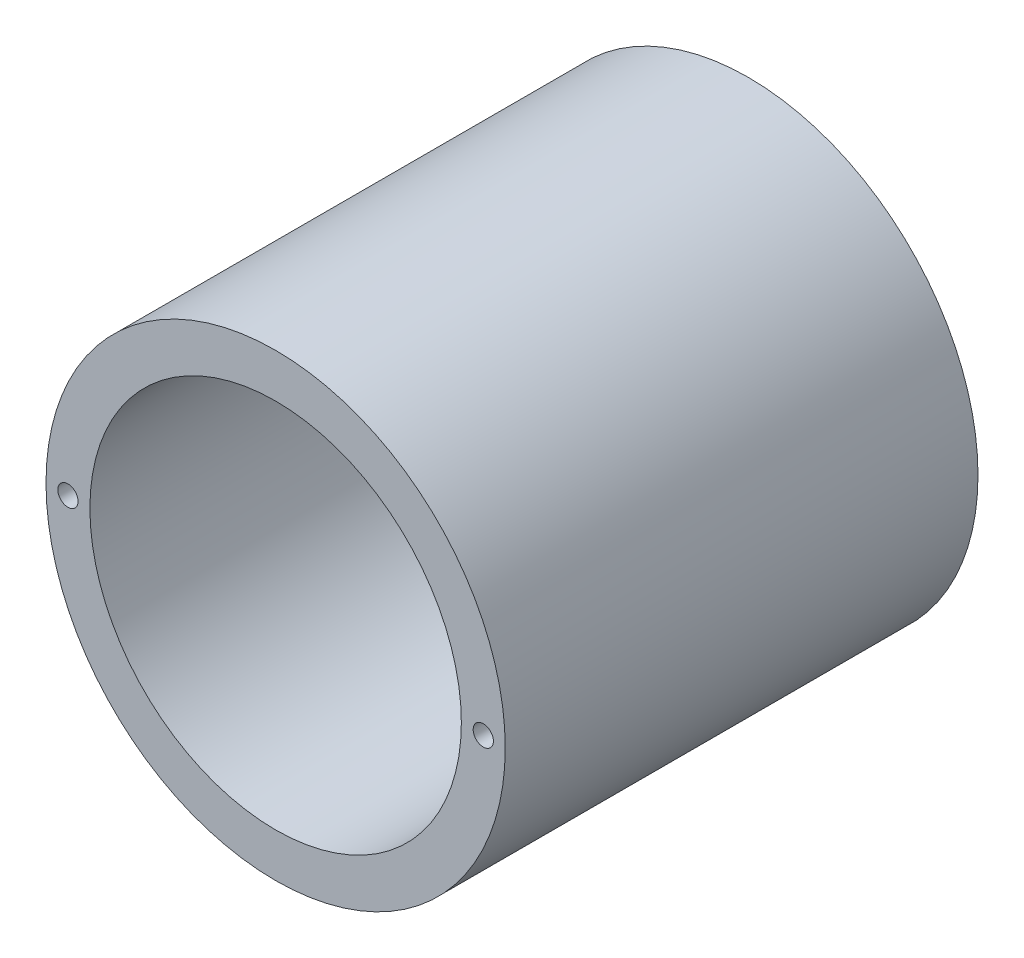
ISO-10303-21;
HEADER;
FILE_DESCRIPTION(('STEP AP214'),'2;1');
FILE_NAME('part.step','',(''),(''),'','','');
FILE_SCHEMA(('AUTOMOTIVE_DESIGN { 1 0 10303 214 1 1 1 1 }'));
ENDSEC;
DATA;
#1=APPLICATION_CONTEXT('core data for automotive mechanical design processes');
#2=APPLICATION_PROTOCOL_DEFINITION('international standard','automotive_design',2000,#1);
#3=PRODUCT_CONTEXT('',#1,'mechanical');
#4=PRODUCT('Part','Part','',(#3));
#5=PRODUCT_RELATED_PRODUCT_CATEGORY('part','',(#4));
#6=PRODUCT_DEFINITION_FORMATION('','',#4);
#7=PRODUCT_DEFINITION_CONTEXT('part definition',#1,'design');
#8=PRODUCT_DEFINITION('design','',#6,#7);
#9=PRODUCT_DEFINITION_SHAPE('','',#8);
#10=(LENGTH_UNIT() NAMED_UNIT(*) SI_UNIT(.MILLI.,.METRE.));
#11=(NAMED_UNIT(*) PLANE_ANGLE_UNIT() SI_UNIT($,.RADIAN.));
#12=(NAMED_UNIT(*) SI_UNIT($,.STERADIAN.) SOLID_ANGLE_UNIT());
#13=UNCERTAINTY_MEASURE_WITH_UNIT(LENGTH_MEASURE(1.E-05),#10,'distance_accuracy_value','');
#14=(GEOMETRIC_REPRESENTATION_CONTEXT(3) GLOBAL_UNCERTAINTY_ASSIGNED_CONTEXT((#13)) GLOBAL_UNIT_ASSIGNED_CONTEXT((#10,
#11,#12)) REPRESENTATION_CONTEXT('',''));
#15=CARTESIAN_POINT('',(0.,0.,0.));
#16=DIRECTION('',(0.,0.,1.));
#17=DIRECTION('',(1.,0.,0.));
#18=AXIS2_PLACEMENT_3D('',#15,#16,#17);
#19=CARTESIAN_POINT('',(0.,0.,70.));
#20=DIRECTION('',(0.,0.,-1.));
#21=DIRECTION('',(-1.,0.,0.));
#22=AXIS2_PLACEMENT_3D('',#19,#20,#21);
#23=CYLINDRICAL_SURFACE('',#22,34.);
#24=CARTESIAN_POINT('',(0.,0.,70.));
#25=DIRECTION('',(0.,0.,1.));
#26=DIRECTION('',(1.,0.,0.));
#27=AXIS2_PLACEMENT_3D('',#24,#25,#26);
#28=CIRCLE('',#27,34.);
#29=CARTESIAN_POINT('',(34.,0.,70.));
#30=VERTEX_POINT('',#29);
#31=EDGE_CURVE('E11',#30,#30,#28,.T.);
#32=ORIENTED_EDGE('',*,*,#31,.F.);
#33=EDGE_LOOP('',(#32));
#34=FACE_BOUND('',#33,.T.);
#35=CARTESIAN_POINT('',(0.,0.,0.));
#36=DIRECTION('',(0.,0.,1.));
#37=DIRECTION('',(1.,0.,0.));
#38=AXIS2_PLACEMENT_3D('',#35,#36,#37);
#39=CIRCLE('',#38,34.);
#40=CARTESIAN_POINT('',(34.,0.,0.));
#41=VERTEX_POINT('',#40);
#42=EDGE_CURVE('E42',#41,#41,#39,.T.);
#43=ORIENTED_EDGE('',*,*,#42,.T.);
#44=EDGE_LOOP('',(#43));
#45=FACE_BOUND('',#44,.T.);
#46=ADVANCED_FACE('F39',(#34,#45),#23,.T.);
#47=CARTESIAN_POINT('',(0.,0.,70.));
#48=DIRECTION('',(0.,0.,1.));
#49=DIRECTION('',(1.,0.,0.));
#50=AXIS2_PLACEMENT_3D('',#47,#48,#49);
#51=PLANE('',#50);
#52=CARTESIAN_POINT('',(-30.75,0.,70.));
#53=DIRECTION('',(0.,0.,1.));
#54=DIRECTION('',(1.,0.,0.));
#55=AXIS2_PLACEMENT_3D('',#52,#53,#54);
#56=CIRCLE('',#55,1.5);
#57=CARTESIAN_POINT('',(-29.25,0.,70.));
#58=VERTEX_POINT('',#57);
#59=EDGE_CURVE('E97',#58,#58,#56,.T.);
#60=ORIENTED_EDGE('',*,*,#59,.F.);
#61=EDGE_LOOP('',(#60));
#62=FACE_BOUND('',#61,.T.);
#63=CARTESIAN_POINT('',(30.75,0.,70.));
#64=DIRECTION('',(0.,0.,1.));
#65=DIRECTION('',(1.,0.,0.));
#66=AXIS2_PLACEMENT_3D('',#63,#64,#65);
#67=CIRCLE('',#66,1.5);
#68=CARTESIAN_POINT('',(32.25,0.,70.));
#69=VERTEX_POINT('',#68);
#70=EDGE_CURVE('E92',#69,#69,#67,.T.);
#71=ORIENTED_EDGE('',*,*,#70,.F.);
#72=EDGE_LOOP('',(#71));
#73=FACE_BOUND('',#72,.T.);
#74=CARTESIAN_POINT('',(0.,0.,70.));
#75=DIRECTION('',(0.,0.,1.));
#76=DIRECTION('',(1.,0.,0.));
#77=AXIS2_PLACEMENT_3D('',#74,#75,#76);
#78=CIRCLE('',#77,27.5);
#79=CARTESIAN_POINT('',(27.5,0.,70.));
#80=VERTEX_POINT('',#79);
#81=EDGE_CURVE('E114',#80,#80,#78,.T.);
#82=ORIENTED_EDGE('',*,*,#81,.F.);
#83=EDGE_LOOP('',(#82));
#84=FACE_BOUND('',#83,.T.);
#85=ORIENTED_EDGE('',*,*,#31,.T.);
#86=EDGE_LOOP('',(#85));
#87=FACE_BOUND('',#86,.T.);
#88=ADVANCED_FACE('F125',(#62,#73,#84,#87),#51,.T.);
#89=CARTESIAN_POINT('',(0.,0.,0.));
#90=DIRECTION('',(0.,0.,1.));
#91=DIRECTION('',(1.,0.,0.));
#92=AXIS2_PLACEMENT_3D('',#89,#90,#91);
#93=PLANE('',#92);
#94=CARTESIAN_POINT('',(10.,22.,0.));
#95=DIRECTION('',(0.,0.,-1.));
#96=DIRECTION('',(-1.,0.,0.));
#97=AXIS2_PLACEMENT_3D('',#94,#95,#96);
#98=CIRCLE('',#97,2.1);
#99=CARTESIAN_POINT('',(7.9,22.,0.));
#100=VERTEX_POINT('',#99);
#101=EDGE_CURVE('E70',#100,#100,#98,.T.);
#102=ORIENTED_EDGE('',*,*,#101,.F.);
#103=EDGE_LOOP('',(#102));
#104=FACE_BOUND('',#103,.T.);
#105=CARTESIAN_POINT('',(-10.,22.,0.));
#106=DIRECTION('',(0.,0.,-1.));
#107=DIRECTION('',(-1.,0.,0.));
#108=AXIS2_PLACEMENT_3D('',#105,#106,#107);
#109=CIRCLE('',#108,2.1);
#110=CARTESIAN_POINT('',(-12.1,22.,0.));
#111=VERTEX_POINT('',#110);
#112=EDGE_CURVE('E69',#111,#111,#109,.T.);
#113=ORIENTED_EDGE('',*,*,#112,.F.);
#114=EDGE_LOOP('',(#113));
#115=FACE_BOUND('',#114,.T.);
#116=CARTESIAN_POINT('',(-10.,-22.,0.));
#117=DIRECTION('',(0.,0.,-1.));
#118=DIRECTION('',(-1.,0.,0.));
#119=AXIS2_PLACEMENT_3D('',#116,#117,#118);
#120=CIRCLE('',#119,2.1);
#121=CARTESIAN_POINT('',(-12.1,-22.,0.));
#122=VERTEX_POINT('',#121);
#123=EDGE_CURVE('E80',#122,#122,#120,.T.);
#124=ORIENTED_EDGE('',*,*,#123,.F.);
#125=EDGE_LOOP('',(#124));
#126=FACE_BOUND('',#125,.T.);
#127=CARTESIAN_POINT('',(10.,-22.,0.));
#128=DIRECTION('',(0.,0.,-1.));
#129=DIRECTION('',(-1.,0.,0.));
#130=AXIS2_PLACEMENT_3D('',#127,#128,#129);
#131=CIRCLE('',#130,2.1);
#132=CARTESIAN_POINT('',(7.9,-22.,0.));
#133=VERTEX_POINT('',#132);
#134=EDGE_CURVE('E86',#133,#133,#131,.T.);
#135=ORIENTED_EDGE('',*,*,#134,.F.);
#136=EDGE_LOOP('',(#135));
#137=FACE_BOUND('',#136,.T.);
#138=CARTESIAN_POINT('',(0.,0.,0.));
#139=DIRECTION('',(0.,0.,-1.));
#140=DIRECTION('',(-1.,0.,0.));
#141=AXIS2_PLACEMENT_3D('',#138,#139,#140);
#142=CIRCLE('',#141,12.);
#143=CARTESIAN_POINT('',(-12.,0.,0.));
#144=VERTEX_POINT('',#143);
#145=EDGE_CURVE('E96',#144,#144,#142,.T.);
#146=ORIENTED_EDGE('',*,*,#145,.F.);
#147=EDGE_LOOP('',(#146));
#148=FACE_BOUND('',#147,.T.);
#149=ORIENTED_EDGE('',*,*,#42,.F.);
#150=EDGE_LOOP('',(#149));
#151=FACE_BOUND('',#150,.T.);
#152=ADVANCED_FACE('F128',(#104,#115,#126,#137,#148,#151),#93,.F.);
#153=CARTESIAN_POINT('',(0.,0.,30.));
#154=DIRECTION('',(0.,0.,1.));
#155=DIRECTION('',(1.,0.,0.));
#156=AXIS2_PLACEMENT_3D('',#153,#154,#155);
#157=CYLINDRICAL_SURFACE('',#156,27.5);
#158=CARTESIAN_POINT('',(0.,0.,30.));
#159=DIRECTION('',(0.,0.,1.));
#160=DIRECTION('',(1.,0.,0.));
#161=AXIS2_PLACEMENT_3D('',#158,#159,#160);
#162=CIRCLE('',#161,27.5);
#163=CARTESIAN_POINT('',(27.5,0.,30.));
#164=VERTEX_POINT('',#163);
#165=EDGE_CURVE('E117',#164,#164,#162,.T.);
#166=ORIENTED_EDGE('',*,*,#165,.F.);
#167=EDGE_LOOP('',(#166));
#168=FACE_BOUND('',#167,.T.);
#169=ORIENTED_EDGE('',*,*,#81,.T.);
#170=EDGE_LOOP('',(#169));
#171=FACE_BOUND('',#170,.T.);
#172=ADVANCED_FACE('F123',(#168,#171),#157,.F.);
#173=CARTESIAN_POINT('',(0.,0.,30.));
#174=DIRECTION('',(0.,0.,1.));
#175=DIRECTION('',(1.,0.,0.));
#176=AXIS2_PLACEMENT_3D('',#173,#174,#175);
#177=PLANE('',#176);
#178=CARTESIAN_POINT('',(0.,0.,30.));
#179=DIRECTION('',(0.,0.,1.));
#180=DIRECTION('',(1.,0.,0.));
#181=AXIS2_PLACEMENT_3D('',#178,#179,#180);
#182=CIRCLE('',#181,21.5);
#183=CARTESIAN_POINT('',(21.5,0.,30.));
#184=VERTEX_POINT('',#183);
#185=EDGE_CURVE('E108',#184,#184,#182,.T.);
#186=ORIENTED_EDGE('',*,*,#185,.F.);
#187=EDGE_LOOP('',(#186));
#188=FACE_BOUND('',#187,.T.);
#189=ORIENTED_EDGE('',*,*,#165,.T.);
#190=EDGE_LOOP('',(#189));
#191=FACE_BOUND('',#190,.T.);
#192=ADVANCED_FACE('F143',(#188,#191),#177,.T.);
#193=CARTESIAN_POINT('',(0.,0.,20.));
#194=DIRECTION('',(0.,0.,1.));
#195=DIRECTION('',(1.,0.,0.));
#196=AXIS2_PLACEMENT_3D('',#193,#194,#195);
#197=CYLINDRICAL_SURFACE('',#196,21.5);
#198=CARTESIAN_POINT('',(0.,0.,20.));
#199=DIRECTION('',(0.,0.,1.));
#200=DIRECTION('',(1.,0.,0.));
#201=AXIS2_PLACEMENT_3D('',#198,#199,#200);
#202=CIRCLE('',#201,21.5);
#203=CARTESIAN_POINT('',(21.5,0.,20.));
#204=VERTEX_POINT('',#203);
#205=EDGE_CURVE('E111',#204,#204,#202,.T.);
#206=ORIENTED_EDGE('',*,*,#205,.F.);
#207=EDGE_LOOP('',(#206));
#208=FACE_BOUND('',#207,.T.);
#209=ORIENTED_EDGE('',*,*,#185,.T.);
#210=EDGE_LOOP('',(#209));
#211=FACE_BOUND('',#210,.T.);
#212=ADVANCED_FACE('F151',(#208,#211),#197,.F.);
#213=CARTESIAN_POINT('',(0.,0.,20.));
#214=DIRECTION('',(0.,0.,1.));
#215=DIRECTION('',(1.,0.,0.));
#216=AXIS2_PLACEMENT_3D('',#213,#214,#215);
#217=PLANE('',#216);
#218=CARTESIAN_POINT('',(0.,0.,20.));
#219=DIRECTION('',(0.,0.,-1.));
#220=DIRECTION('',(-1.,0.,0.));
#221=AXIS2_PLACEMENT_3D('',#218,#219,#220);
#222=CIRCLE('',#221,12.);
#223=CARTESIAN_POINT('',(-12.,0.,20.));
#224=VERTEX_POINT('',#223);
#225=EDGE_CURVE('E105',#224,#224,#222,.T.);
#226=ORIENTED_EDGE('',*,*,#225,.T.);
#227=EDGE_LOOP('',(#226));
#228=FACE_BOUND('',#227,.T.);
#229=ORIENTED_EDGE('',*,*,#205,.T.);
#230=EDGE_LOOP('',(#229));
#231=FACE_BOUND('',#230,.T.);
#232=ADVANCED_FACE('F155',(#228,#231),#217,.T.);
#233=CARTESIAN_POINT('',(0.,0.,20.));
#234=DIRECTION('',(0.,0.,-1.));
#235=DIRECTION('',(-1.,0.,0.));
#236=AXIS2_PLACEMENT_3D('',#233,#234,#235);
#237=CYLINDRICAL_SURFACE('',#236,12.);
#238=ORIENTED_EDGE('',*,*,#225,.F.);
#239=EDGE_LOOP('',(#238));
#240=FACE_BOUND('',#239,.T.);
#241=ORIENTED_EDGE('',*,*,#145,.T.);
#242=EDGE_LOOP('',(#241));
#243=FACE_BOUND('',#242,.T.);
#244=ADVANCED_FACE('F159',(#240,#243),#237,.F.);
#245=CARTESIAN_POINT('',(30.75,0.,50.));
#246=DIRECTION('',(0.,0.,1.));
#247=DIRECTION('',(1.,0.,0.));
#248=AXIS2_PLACEMENT_3D('',#245,#246,#247);
#249=CYLINDRICAL_SURFACE('',#248,1.5);
#250=CARTESIAN_POINT('',(30.75,0.,50.));
#251=DIRECTION('',(0.,0.,1.));
#252=DIRECTION('',(1.,0.,0.));
#253=AXIS2_PLACEMENT_3D('',#250,#251,#252);
#254=CIRCLE('',#253,1.5);
#255=CARTESIAN_POINT('',(32.25,0.,50.));
#256=VERTEX_POINT('',#255);
#257=EDGE_CURVE('E100',#256,#256,#254,.T.);
#258=ORIENTED_EDGE('',*,*,#257,.F.);
#259=EDGE_LOOP('',(#258));
#260=FACE_BOUND('',#259,.T.);
#261=ORIENTED_EDGE('',*,*,#70,.T.);
#262=EDGE_LOOP('',(#261));
#263=FACE_BOUND('',#262,.T.);
#264=ADVANCED_FACE('F163',(#260,#263),#249,.F.);
#265=CARTESIAN_POINT('',(30.75,0.,50.));
#266=DIRECTION('',(0.,0.,1.));
#267=DIRECTION('',(1.,0.,0.));
#268=AXIS2_PLACEMENT_3D('',#265,#266,#267);
#269=PLANE('',#268);
#270=ORIENTED_EDGE('',*,*,#257,.T.);
#271=EDGE_LOOP('',(#270));
#272=FACE_BOUND('',#271,.T.);
#273=ADVANCED_FACE('F167',(#272),#269,.T.);
#274=CARTESIAN_POINT('',(-30.75,0.,50.));
#275=DIRECTION('',(0.,0.,1.));
#276=DIRECTION('',(1.,0.,0.));
#277=AXIS2_PLACEMENT_3D('',#274,#275,#276);
#278=CYLINDRICAL_SURFACE('',#277,1.5);
#279=CARTESIAN_POINT('',(-30.75,0.,50.));
#280=DIRECTION('',(0.,0.,1.));
#281=DIRECTION('',(1.,0.,0.));
#282=AXIS2_PLACEMENT_3D('',#279,#280,#281);
#283=CIRCLE('',#282,1.5);
#284=CARTESIAN_POINT('',(-29.25,0.,50.));
#285=VERTEX_POINT('',#284);
#286=EDGE_CURVE('E93',#285,#285,#283,.T.);
#287=ORIENTED_EDGE('',*,*,#286,.F.);
#288=EDGE_LOOP('',(#287));
#289=FACE_BOUND('',#288,.T.);
#290=ORIENTED_EDGE('',*,*,#59,.T.);
#291=EDGE_LOOP('',(#290));
#292=FACE_BOUND('',#291,.T.);
#293=ADVANCED_FACE('F171',(#289,#292),#278,.F.);
#294=CARTESIAN_POINT('',(-30.75,0.,50.));
#295=DIRECTION('',(0.,0.,1.));
#296=DIRECTION('',(1.,0.,0.));
#297=AXIS2_PLACEMENT_3D('',#294,#295,#296);
#298=PLANE('',#297);
#299=ORIENTED_EDGE('',*,*,#286,.T.);
#300=EDGE_LOOP('',(#299));
#301=FACE_BOUND('',#300,.T.);
#302=ADVANCED_FACE('F175',(#301),#298,.T.);
#303=CARTESIAN_POINT('',(10.,-22.,10.));
#304=DIRECTION('',(0.,0.,-1.));
#305=DIRECTION('',(-1.,0.,0.));
#306=AXIS2_PLACEMENT_3D('',#303,#304,#305);
#307=CONICAL_SURFACE('',#306,2.1,1.02974425867665);
#308=CARTESIAN_POINT('',(9.99999999999999,-22.,11.2618072999579));
#309=VERTEX_POINT('',#308);
#310=VERTEX_LOOP('',#309);
#311=FACE_BOUND('',#310,.T.);
#312=CARTESIAN_POINT('',(10.,-22.,10.));
#313=DIRECTION('',(0.,0.,-1.));
#314=DIRECTION('',(-1.,0.,0.));
#315=AXIS2_PLACEMENT_3D('',#312,#313,#314);
#316=CIRCLE('',#315,2.1);
#317=CARTESIAN_POINT('',(7.9,-22.,10.));
#318=VERTEX_POINT('',#317);
#319=EDGE_CURVE('E89',#318,#318,#316,.T.);
#320=ORIENTED_EDGE('',*,*,#319,.T.);
#321=EDGE_LOOP('',(#320));
#322=FACE_BOUND('',#321,.T.);
#323=ADVANCED_FACE('F179',(#311,#322),#307,.F.);
#324=CARTESIAN_POINT('',(10.,-22.,0.));
#325=DIRECTION('',(0.,0.,-1.));
#326=DIRECTION('',(-1.,0.,0.));
#327=AXIS2_PLACEMENT_3D('',#324,#325,#326);
#328=CYLINDRICAL_SURFACE('',#327,2.1);
#329=ORIENTED_EDGE('',*,*,#319,.F.);
#330=EDGE_LOOP('',(#329));
#331=FACE_BOUND('',#330,.T.);
#332=ORIENTED_EDGE('',*,*,#134,.T.);
#333=EDGE_LOOP('',(#332));
#334=FACE_BOUND('',#333,.T.);
#335=ADVANCED_FACE('F183',(#331,#334),#328,.F.);
#336=CARTESIAN_POINT('',(-10.,-22.,10.));
#337=DIRECTION('',(0.,0.,-1.));
#338=DIRECTION('',(-1.,0.,0.));
#339=AXIS2_PLACEMENT_3D('',#336,#337,#338);
#340=CONICAL_SURFACE('',#339,2.1,1.02974425867665);
#341=CARTESIAN_POINT('',(-10.,-22.,11.2618072999579));
#342=VERTEX_POINT('',#341);
#343=VERTEX_LOOP('',#342);
#344=FACE_BOUND('',#343,.T.);
#345=CARTESIAN_POINT('',(-10.,-22.,10.));
#346=DIRECTION('',(0.,0.,-1.));
#347=DIRECTION('',(-1.,0.,0.));
#348=AXIS2_PLACEMENT_3D('',#345,#346,#347);
#349=CIRCLE('',#348,2.1);
#350=CARTESIAN_POINT('',(-12.1,-22.,10.));
#351=VERTEX_POINT('',#350);
#352=EDGE_CURVE('E83',#351,#351,#349,.T.);
#353=ORIENTED_EDGE('',*,*,#352,.T.);
#354=EDGE_LOOP('',(#353));
#355=FACE_BOUND('',#354,.T.);
#356=ADVANCED_FACE('F186',(#344,#355),#340,.F.);
#357=CARTESIAN_POINT('',(-10.,-22.,0.));
#358=DIRECTION('',(0.,0.,-1.));
#359=DIRECTION('',(-1.,0.,0.));
#360=AXIS2_PLACEMENT_3D('',#357,#358,#359);
#361=CYLINDRICAL_SURFACE('',#360,2.1);
#362=ORIENTED_EDGE('',*,*,#352,.F.);
#363=EDGE_LOOP('',(#362));
#364=FACE_BOUND('',#363,.T.);
#365=ORIENTED_EDGE('',*,*,#123,.T.);
#366=EDGE_LOOP('',(#365));
#367=FACE_BOUND('',#366,.T.);
#368=ADVANCED_FACE('F190',(#364,#367),#361,.F.);
#369=CARTESIAN_POINT('',(-10.,22.,10.));
#370=DIRECTION('',(0.,0.,-1.));
#371=DIRECTION('',(-1.,0.,0.));
#372=AXIS2_PLACEMENT_3D('',#369,#370,#371);
#373=CONICAL_SURFACE('',#372,2.1,1.02974425867665);
#374=CARTESIAN_POINT('',(-10.,22.,11.2618072999579));
#375=VERTEX_POINT('',#374);
#376=VERTEX_LOOP('',#375);
#377=FACE_BOUND('',#376,.T.);
#378=CARTESIAN_POINT('',(-10.,22.,10.));
#379=DIRECTION('',(0.,0.,-1.));
#380=DIRECTION('',(-1.,0.,0.));
#381=AXIS2_PLACEMENT_3D('',#378,#379,#380);
#382=CIRCLE('',#381,2.1);
#383=CARTESIAN_POINT('',(-12.1,22.,10.));
#384=VERTEX_POINT('',#383);
#385=EDGE_CURVE('E73',#384,#384,#382,.T.);
#386=ORIENTED_EDGE('',*,*,#385,.T.);
#387=EDGE_LOOP('',(#386));
#388=FACE_BOUND('',#387,.T.);
#389=ADVANCED_FACE('F193',(#377,#388),#373,.F.);
#390=CARTESIAN_POINT('',(-10.,22.,0.));
#391=DIRECTION('',(0.,0.,-1.));
#392=DIRECTION('',(-1.,0.,0.));
#393=AXIS2_PLACEMENT_3D('',#390,#391,#392);
#394=CYLINDRICAL_SURFACE('',#393,2.1);
#395=ORIENTED_EDGE('',*,*,#385,.F.);
#396=EDGE_LOOP('',(#395));
#397=FACE_BOUND('',#396,.T.);
#398=ORIENTED_EDGE('',*,*,#112,.T.);
#399=EDGE_LOOP('',(#398));
#400=FACE_BOUND('',#399,.T.);
#401=ADVANCED_FACE('F63',(#397,#400),#394,.F.);
#402=CARTESIAN_POINT('',(10.,22.,10.));
#403=DIRECTION('',(0.,0.,-1.));
#404=DIRECTION('',(-1.,0.,0.));
#405=AXIS2_PLACEMENT_3D('',#402,#403,#404);
#406=CONICAL_SURFACE('',#405,2.1,1.02974425867665);
#407=CARTESIAN_POINT('',(10.,22.,11.2618072999579));
#408=VERTEX_POINT('',#407);
#409=VERTEX_LOOP('',#408);
#410=FACE_BOUND('',#409,.T.);
#411=CARTESIAN_POINT('',(10.,22.,10.));
#412=DIRECTION('',(0.,0.,-1.));
#413=DIRECTION('',(-1.,0.,0.));
#414=AXIS2_PLACEMENT_3D('',#411,#412,#413);
#415=CIRCLE('',#414,2.1);
#416=CARTESIAN_POINT('',(7.9,22.,10.));
#417=VERTEX_POINT('',#416);
#418=EDGE_CURVE('E67',#417,#417,#415,.T.);
#419=ORIENTED_EDGE('',*,*,#418,.T.);
#420=EDGE_LOOP('',(#419));
#421=FACE_BOUND('',#420,.T.);
#422=ADVANCED_FACE('F59',(#410,#421),#406,.F.);
#423=CARTESIAN_POINT('',(10.,22.,0.));
#424=DIRECTION('',(0.,0.,-1.));
#425=DIRECTION('',(-1.,0.,0.));
#426=AXIS2_PLACEMENT_3D('',#423,#424,#425);
#427=CYLINDRICAL_SURFACE('',#426,2.1);
#428=ORIENTED_EDGE('',*,*,#418,.F.);
#429=EDGE_LOOP('',(#428));
#430=FACE_BOUND('',#429,.T.);
#431=ORIENTED_EDGE('',*,*,#101,.T.);
#432=EDGE_LOOP('',(#431));
#433=FACE_BOUND('',#432,.T.);
#434=ADVANCED_FACE('F62',(#430,#433),#427,.F.);
#435=CLOSED_SHELL('',(#46,#88,#152,#172,#192,#212,#232,#244,#264,#273,#293,#302,#323,#335,#356,
#368,#389,#401,#422,#434));
#436=MANIFOLD_SOLID_BREP('B2',#435);
#437=ADVANCED_BREP_SHAPE_REPRESENTATION('',(#18,#436),#14);
#438=SHAPE_DEFINITION_REPRESENTATION(#9,#437);
ENDSEC;
END-ISO-10303-21;
